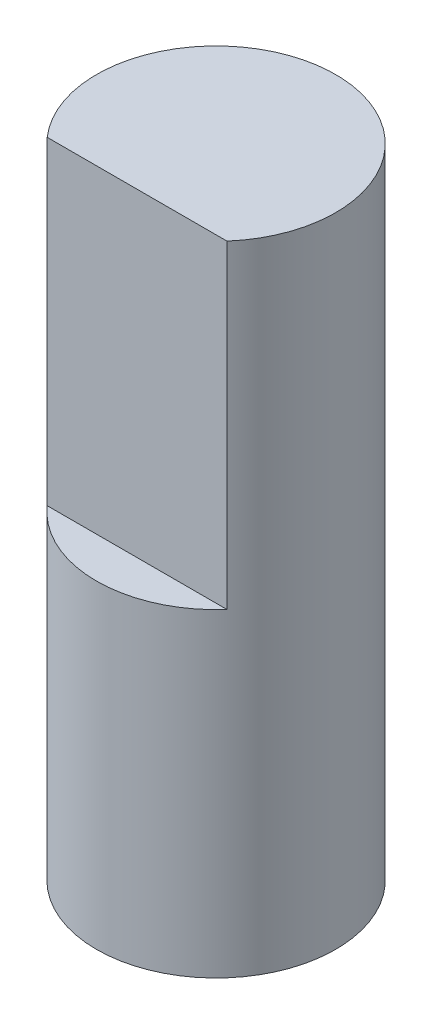
ISO-10303-21;
HEADER;
FILE_DESCRIPTION(('STEP AP214'),'2;1');
FILE_NAME('part.step','',(''),(''),'','','');
FILE_SCHEMA(('AUTOMOTIVE_DESIGN { 1 0 10303 214 1 1 1 1 }'));
ENDSEC;
DATA;
#1=APPLICATION_CONTEXT('core data for automotive mechanical design processes');
#2=APPLICATION_PROTOCOL_DEFINITION('international standard','automotive_design',2000,#1);
#3=PRODUCT_CONTEXT('',#1,'mechanical');
#4=PRODUCT('Part','Part','',(#3));
#5=PRODUCT_RELATED_PRODUCT_CATEGORY('part','',(#4));
#6=PRODUCT_DEFINITION_FORMATION('','',#4);
#7=PRODUCT_DEFINITION_CONTEXT('part definition',#1,'design');
#8=PRODUCT_DEFINITION('design','',#6,#7);
#9=PRODUCT_DEFINITION_SHAPE('','',#8);
#10=(LENGTH_UNIT() NAMED_UNIT(*) SI_UNIT(.MILLI.,.METRE.));
#11=(NAMED_UNIT(*) PLANE_ANGLE_UNIT() SI_UNIT($,.RADIAN.));
#12=(NAMED_UNIT(*) SI_UNIT($,.STERADIAN.) SOLID_ANGLE_UNIT());
#13=UNCERTAINTY_MEASURE_WITH_UNIT(LENGTH_MEASURE(1.E-05),#10,'distance_accuracy_value','');
#14=(GEOMETRIC_REPRESENTATION_CONTEXT(3) GLOBAL_UNCERTAINTY_ASSIGNED_CONTEXT((#13)) GLOBAL_UNIT_ASSIGNED_CONTEXT((#10,
#11,#12)) REPRESENTATION_CONTEXT('',''));
#15=CARTESIAN_POINT('',(0.,0.,0.));
#16=DIRECTION('',(0.,0.,1.));
#17=DIRECTION('',(1.,0.,0.));
#18=AXIS2_PLACEMENT_3D('',#15,#16,#17);
#19=CARTESIAN_POINT('',(0.,8.,0.));
#20=DIRECTION('',(0.,-1.,0.));
#21=DIRECTION('',(0.,0.,-1.));
#22=AXIS2_PLACEMENT_3D('',#19,#20,#21);
#23=CYLINDRICAL_SURFACE('',#22,1.5);
#24=CARTESIAN_POINT('',(0.,8.,0.));
#25=DIRECTION('',(0.,1.,0.));
#26=DIRECTION('',(0.,0.,1.));
#27=AXIS2_PLACEMENT_3D('',#24,#25,#26);
#28=CIRCLE('',#27,1.5);
#29=CARTESIAN_POINT('',(1.12642179624307,8.,0.990542243899035));
#30=VERTEX_POINT('',#29);
#31=CARTESIAN_POINT('',(-1.12642179624307,8.,0.990542243899035));
#32=VERTEX_POINT('',#31);
#33=EDGE_CURVE('E11',#30,#32,#28,.T.);
#34=ORIENTED_EDGE('',*,*,#33,.F.);
#35=DIRECTION('',(0.,1.,0.));
#36=VECTOR('',#35,1.);
#37=CARTESIAN_POINT('',(1.12642179624307,4.,0.990542243899035));
#38=LINE('',#37,#36);
#39=CARTESIAN_POINT('',(1.12642179624307,4.,0.990542243899035));
#40=VERTEX_POINT('',#39);
#41=EDGE_CURVE('E49',#40,#30,#38,.T.);
#42=ORIENTED_EDGE('',*,*,#41,.F.);
#43=CARTESIAN_POINT('',(0.,4.,0.));
#44=DIRECTION('',(0.,1.,0.));
#45=DIRECTION('',(0.,0.,1.));
#46=AXIS2_PLACEMENT_3D('',#43,#44,#45);
#47=CIRCLE('',#46,1.5);
#48=CARTESIAN_POINT('',(-1.12642179624307,4.,0.990542243899035));
#49=VERTEX_POINT('',#48);
#50=EDGE_CURVE('E64',#49,#40,#47,.T.);
#51=ORIENTED_EDGE('',*,*,#50,.F.);
#52=DIRECTION('',(0.,1.,0.));
#53=VECTOR('',#52,1.);
#54=CARTESIAN_POINT('',(-1.12642179624307,4.,0.990542243899035));
#55=LINE('',#54,#53);
#56=EDGE_CURVE('E55',#49,#32,#55,.T.);
#57=ORIENTED_EDGE('',*,*,#56,.T.);
#58=EDGE_LOOP('',(#34,#42,#51,#57));
#59=FACE_BOUND('',#58,.T.);
#60=CARTESIAN_POINT('',(0.,0.,0.));
#61=DIRECTION('',(0.,1.,0.));
#62=DIRECTION('',(0.,0.,1.));
#63=AXIS2_PLACEMENT_3D('',#60,#61,#62);
#64=CIRCLE('',#63,1.5);
#65=CARTESIAN_POINT('',(0.,0.,1.5));
#66=VERTEX_POINT('',#65);
#67=EDGE_CURVE('E38',#66,#66,#64,.T.);
#68=ORIENTED_EDGE('',*,*,#67,.T.);
#69=EDGE_LOOP('',(#68));
#70=FACE_BOUND('',#69,.T.);
#71=ADVANCED_FACE('F35',(#59,#70),#23,.T.);
#72=CARTESIAN_POINT('',(0.,8.,0.));
#73=DIRECTION('',(0.,1.,0.));
#74=DIRECTION('',(0.,0.,1.));
#75=AXIS2_PLACEMENT_3D('',#72,#73,#74);
#76=PLANE('',#75);
#77=DIRECTION('',(-1.,0.,0.));
#78=VECTOR('',#77,1.);
#79=CARTESIAN_POINT('',(-1.12642179624307,8.,0.990542243899035));
#80=LINE('',#79,#78);
#81=EDGE_CURVE('E60',#30,#32,#80,.T.);
#82=ORIENTED_EDGE('',*,*,#81,.F.);
#83=ORIENTED_EDGE('',*,*,#33,.T.);
#84=EDGE_LOOP('',(#82,#83));
#85=FACE_BOUND('',#84,.T.);
#86=ADVANCED_FACE('F70',(#85),#76,.T.);
#87=CARTESIAN_POINT('',(0.,0.,0.));
#88=DIRECTION('',(0.,1.,0.));
#89=DIRECTION('',(0.,0.,1.));
#90=AXIS2_PLACEMENT_3D('',#87,#88,#89);
#91=PLANE('',#90);
#92=ORIENTED_EDGE('',*,*,#67,.F.);
#93=EDGE_LOOP('',(#92));
#94=FACE_BOUND('',#93,.T.);
#95=ADVANCED_FACE('F72',(#94),#91,.F.);
#96=CARTESIAN_POINT('',(-1.12642179624307,4.,0.990542243899035));
#97=DIRECTION('',(0.,0.,-1.));
#98=DIRECTION('',(-1.,0.,0.));
#99=AXIS2_PLACEMENT_3D('',#96,#97,#98);
#100=PLANE('',#99);
#101=ORIENTED_EDGE('',*,*,#81,.T.);
#102=ORIENTED_EDGE('',*,*,#56,.F.);
#103=DIRECTION('',(-1.,0.,0.));
#104=VECTOR('',#103,1.);
#105=CARTESIAN_POINT('',(-1.12642179624307,4.,0.990542243899035));
#106=LINE('',#105,#104);
#107=EDGE_CURVE('E88',#40,#49,#106,.T.);
#108=ORIENTED_EDGE('',*,*,#107,.F.);
#109=ORIENTED_EDGE('',*,*,#41,.T.);
#110=EDGE_LOOP('',(#101,#102,#108,#109));
#111=FACE_BOUND('',#110,.T.);
#112=ADVANCED_FACE('F61',(#111),#100,.F.);
#113=CARTESIAN_POINT('',(0.,4.,0.));
#114=DIRECTION('',(0.,1.,0.));
#115=DIRECTION('',(0.,0.,1.));
#116=AXIS2_PLACEMENT_3D('',#113,#114,#115);
#117=PLANE('',#116);
#118=ORIENTED_EDGE('',*,*,#50,.T.);
#119=ORIENTED_EDGE('',*,*,#107,.T.);
#120=EDGE_LOOP('',(#118,#119));
#121=FACE_BOUND('',#120,.T.);
#122=ADVANCED_FACE('F83',(#121),#117,.T.);
#123=CLOSED_SHELL('',(#71,#86,#95,#112,#122));
#124=MANIFOLD_SOLID_BREP('B2',#123);
#125=ADVANCED_BREP_SHAPE_REPRESENTATION('',(#18,#124),#14);
#126=SHAPE_DEFINITION_REPRESENTATION(#9,#125);
ENDSEC;
END-ISO-10303-21;
